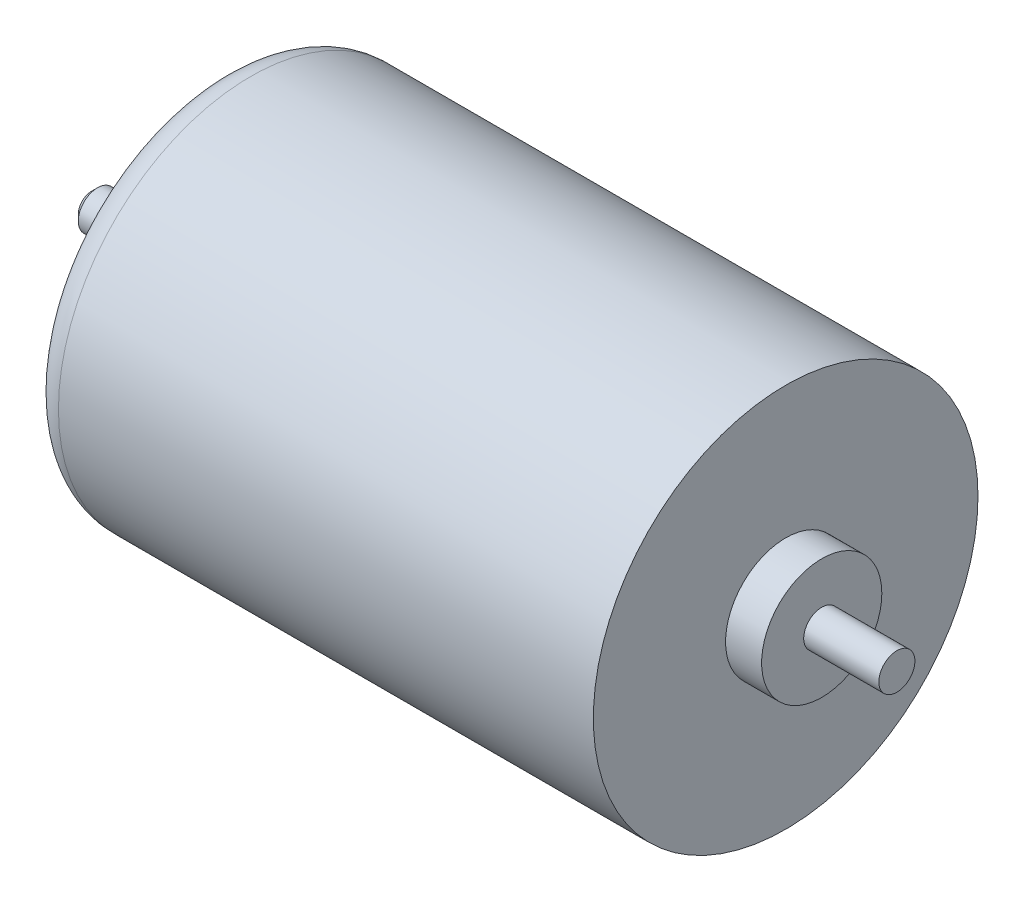
ISO-10303-21;
HEADER;
FILE_DESCRIPTION(('STEP AP214'),'2;1');
FILE_NAME('part.step','',(''),(''),'','','');
FILE_SCHEMA(('AUTOMOTIVE_DESIGN { 1 0 10303 214 1 1 1 1 }'));
ENDSEC;
DATA;
#1=APPLICATION_CONTEXT('core data for automotive mechanical design processes');
#2=APPLICATION_PROTOCOL_DEFINITION('international standard','automotive_design',2000,#1);
#3=PRODUCT_CONTEXT('',#1,'mechanical');
#4=PRODUCT('Part','Part','',(#3));
#5=PRODUCT_RELATED_PRODUCT_CATEGORY('part','',(#4));
#6=PRODUCT_DEFINITION_FORMATION('','',#4);
#7=PRODUCT_DEFINITION_CONTEXT('part definition',#1,'design');
#8=PRODUCT_DEFINITION('design','',#6,#7);
#9=PRODUCT_DEFINITION_SHAPE('','',#8);
#10=(LENGTH_UNIT() NAMED_UNIT(*) SI_UNIT(.MILLI.,.METRE.));
#11=(NAMED_UNIT(*) PLANE_ANGLE_UNIT() SI_UNIT($,.RADIAN.));
#12=(NAMED_UNIT(*) SI_UNIT($,.STERADIAN.) SOLID_ANGLE_UNIT());
#13=UNCERTAINTY_MEASURE_WITH_UNIT(LENGTH_MEASURE(1.E-05),#10,'distance_accuracy_value','');
#14=(GEOMETRIC_REPRESENTATION_CONTEXT(3) GLOBAL_UNCERTAINTY_ASSIGNED_CONTEXT((#13)) GLOBAL_UNIT_ASSIGNED_CONTEXT((#10,
#11,#12)) REPRESENTATION_CONTEXT('',''));
#15=CARTESIAN_POINT('',(0.,0.,0.));
#16=DIRECTION('',(0.,0.,1.));
#17=DIRECTION('',(1.,0.,0.));
#18=AXIS2_PLACEMENT_3D('',#15,#16,#17);
#19=CARTESIAN_POINT('',(-67.,0.,0.));
#20=DIRECTION('',(-1.,0.,0.));
#21=DIRECTION('',(0.,0.,1.));
#22=AXIS2_PLACEMENT_3D('',#19,#20,#21);
#23=PLANE('',#22);
#24=CARTESIAN_POINT('',(-67.,0.,0.));
#25=DIRECTION('',(-1.,0.,0.));
#26=DIRECTION('',(0.,0.,1.));
#27=AXIS2_PLACEMENT_3D('',#24,#25,#26);
#28=CIRCLE('',#27,1.10000000000002);
#29=CARTESIAN_POINT('',(-67.,0.,1.10000000000002));
#30=VERTEX_POINT('',#29);
#31=EDGE_CURVE('E11',#30,#30,#28,.T.);
#32=ORIENTED_EDGE('',*,*,#31,.T.);
#33=EDGE_LOOP('',(#32));
#34=FACE_BOUND('',#33,.T.);
#35=ADVANCED_FACE('F51',(#34),#23,.T.);
#36=CARTESIAN_POINT('',(0.,0.,0.));
#37=DIRECTION('',(1.,0.,0.));
#38=DIRECTION('',(0.,0.,-1.));
#39=AXIS2_PLACEMENT_3D('',#36,#37,#38);
#40=CYLINDRICAL_SURFACE('',#39,1.6);
#41=CARTESIAN_POINT('',(-66.5,0.,0.));
#42=DIRECTION('',(-1.,0.,0.));
#43=DIRECTION('',(0.,0.,1.));
#44=AXIS2_PLACEMENT_3D('',#41,#42,#43);
#45=CIRCLE('',#44,1.6);
#46=CARTESIAN_POINT('',(-66.5,0.,1.6));
#47=VERTEX_POINT('',#46);
#48=EDGE_CURVE('E61',#47,#47,#45,.F.);
#49=ORIENTED_EDGE('',*,*,#48,.T.);
#50=EDGE_LOOP('',(#49));
#51=FACE_BOUND('',#50,.T.);
#52=CARTESIAN_POINT('',(-59.85,0.,0.));
#53=DIRECTION('',(1.,0.,0.));
#54=DIRECTION('',(0.,0.,-1.));
#55=AXIS2_PLACEMENT_3D('',#52,#53,#54);
#56=CIRCLE('',#55,1.6);
#57=CARTESIAN_POINT('',(-59.85,0.,-1.6));
#58=VERTEX_POINT('',#57);
#59=EDGE_CURVE('E120',#58,#58,#56,.T.);
#60=ORIENTED_EDGE('',*,*,#59,.F.);
#61=EDGE_LOOP('',(#60));
#62=FACE_BOUND('',#61,.T.);
#63=ADVANCED_FACE('F135',(#51,#62),#40,.T.);
#64=CARTESIAN_POINT('',(-59.85,1.6,0.));
#65=DIRECTION('',(-1.,0.,0.));
#66=DIRECTION('',(0.,0.,1.));
#67=AXIS2_PLACEMENT_3D('',#64,#65,#66);
#68=PLANE('',#67);
#69=ORIENTED_EDGE('',*,*,#59,.T.);
#70=EDGE_LOOP('',(#69));
#71=FACE_BOUND('',#70,.T.);
#72=CARTESIAN_POINT('',(-59.85,0.,0.));
#73=DIRECTION('',(1.,0.,0.));
#74=DIRECTION('',(0.,0.,-1.));
#75=AXIS2_PLACEMENT_3D('',#72,#73,#74);
#76=CIRCLE('',#75,5.);
#77=CARTESIAN_POINT('',(-59.85,0.,-5.));
#78=VERTEX_POINT('',#77);
#79=EDGE_CURVE('E116',#78,#78,#76,.T.);
#80=ORIENTED_EDGE('',*,*,#79,.F.);
#81=EDGE_LOOP('',(#80));
#82=FACE_BOUND('',#81,.T.);
#83=ADVANCED_FACE('F152',(#71,#82),#68,.T.);
#84=CARTESIAN_POINT('',(0.,0.,0.));
#85=DIRECTION('',(1.,0.,0.));
#86=DIRECTION('',(0.,0.,-1.));
#87=AXIS2_PLACEMENT_3D('',#84,#85,#86);
#88=CYLINDRICAL_SURFACE('',#87,5.);
#89=ORIENTED_EDGE('',*,*,#79,.T.);
#90=EDGE_LOOP('',(#89));
#91=FACE_BOUND('',#90,.T.);
#92=CARTESIAN_POINT('',(-56.25,0.,0.));
#93=DIRECTION('',(1.,0.,0.));
#94=DIRECTION('',(0.,0.,-1.));
#95=AXIS2_PLACEMENT_3D('',#92,#93,#94);
#96=CIRCLE('',#95,5.);
#97=CARTESIAN_POINT('',(-56.25,0.,-5.));
#98=VERTEX_POINT('',#97);
#99=EDGE_CURVE('E112',#98,#98,#96,.T.);
#100=ORIENTED_EDGE('',*,*,#99,.F.);
#101=EDGE_LOOP('',(#100));
#102=FACE_BOUND('',#101,.T.);
#103=ADVANCED_FACE('F207',(#91,#102),#88,.T.);
#104=CARTESIAN_POINT('',(-56.25,5.,0.));
#105=DIRECTION('',(-1.,0.,0.));
#106=DIRECTION('',(0.,0.,1.));
#107=AXIS2_PLACEMENT_3D('',#104,#105,#106);
#108=PLANE('',#107);
#109=CARTESIAN_POINT('',(-56.25,10.3,0.));
#110=DIRECTION('',(-1.,0.,0.));
#111=DIRECTION('',(0.,0.,1.));
#112=AXIS2_PLACEMENT_3D('',#109,#110,#111);
#113=CIRCLE('',#112,1.24999999999999);
#114=CARTESIAN_POINT('',(-56.25,10.3,1.24999999999999));
#115=VERTEX_POINT('',#114);
#116=EDGE_CURVE('E79',#115,#115,#113,.T.);
#117=ORIENTED_EDGE('',*,*,#116,.F.);
#118=EDGE_LOOP('',(#117));
#119=FACE_BOUND('',#118,.T.);
#120=CARTESIAN_POINT('',(-56.25,-10.3,0.));
#121=DIRECTION('',(-1.,0.,0.));
#122=DIRECTION('',(0.,0.,1.));
#123=AXIS2_PLACEMENT_3D('',#120,#121,#122);
#124=CIRCLE('',#123,1.24999999999999);
#125=CARTESIAN_POINT('',(-56.25,-10.3,1.24999999999999));
#126=VERTEX_POINT('',#125);
#127=EDGE_CURVE('E78',#126,#126,#124,.T.);
#128=ORIENTED_EDGE('',*,*,#127,.F.);
#129=EDGE_LOOP('',(#128));
#130=FACE_BOUND('',#129,.T.);
#131=CARTESIAN_POINT('',(-56.25,0.,0.));
#132=DIRECTION('',(-1.,0.,0.));
#133=DIRECTION('',(0.,0.,1.));
#134=AXIS2_PLACEMENT_3D('',#131,#132,#133);
#135=CIRCLE('',#134,13.5);
#136=CARTESIAN_POINT('',(-56.25,0.,13.5));
#137=VERTEX_POINT('',#136);
#138=EDGE_CURVE('E128',#137,#137,#135,.T.);
#139=ORIENTED_EDGE('',*,*,#138,.T.);
#140=EDGE_LOOP('',(#139));
#141=FACE_BOUND('',#140,.T.);
#142=ORIENTED_EDGE('',*,*,#99,.T.);
#143=EDGE_LOOP('',(#142));
#144=FACE_BOUND('',#143,.T.);
#145=ADVANCED_FACE('F177',(#119,#130,#141,#144),#108,.T.);
#146=CARTESIAN_POINT('',(0.,0.,0.));
#147=DIRECTION('',(1.,0.,0.));
#148=DIRECTION('',(0.,0.,-1.));
#149=AXIS2_PLACEMENT_3D('',#146,#147,#148);
#150=CYLINDRICAL_SURFACE('',#149,16.);
#151=CARTESIAN_POINT('',(-53.75,0.,0.));
#152=DIRECTION('',(-1.,0.,0.));
#153=DIRECTION('',(0.,0.,1.));
#154=AXIS2_PLACEMENT_3D('',#151,#152,#153);
#155=CIRCLE('',#154,16.);
#156=CARTESIAN_POINT('',(-53.75,0.,16.));
#157=VERTEX_POINT('',#156);
#158=EDGE_CURVE('E124',#157,#157,#155,.F.);
#159=ORIENTED_EDGE('',*,*,#158,.T.);
#160=EDGE_LOOP('',(#159));
#161=FACE_BOUND('',#160,.T.);
#162=CARTESIAN_POINT('',(-9.25,0.,0.));
#163=DIRECTION('',(1.,0.,0.));
#164=DIRECTION('',(0.,0.,-1.));
#165=AXIS2_PLACEMENT_3D('',#162,#163,#164);
#166=CIRCLE('',#165,16.);
#167=CARTESIAN_POINT('',(-9.25,0.,-16.));
#168=VERTEX_POINT('',#167);
#169=EDGE_CURVE('E108',#168,#168,#166,.T.);
#170=ORIENTED_EDGE('',*,*,#169,.F.);
#171=EDGE_LOOP('',(#170));
#172=FACE_BOUND('',#171,.T.);
#173=ADVANCED_FACE('F174',(#161,#172),#150,.T.);
#174=CARTESIAN_POINT('',(-9.25,5.,0.));
#175=DIRECTION('',(1.,0.,0.));
#176=DIRECTION('',(0.,0.,-1.));
#177=AXIS2_PLACEMENT_3D('',#174,#175,#176);
#178=PLANE('',#177);
#179=ORIENTED_EDGE('',*,*,#169,.T.);
#180=EDGE_LOOP('',(#179));
#181=FACE_BOUND('',#180,.T.);
#182=CARTESIAN_POINT('',(-9.25,0.,0.));
#183=DIRECTION('',(1.,0.,0.));
#184=DIRECTION('',(0.,0.,-1.));
#185=AXIS2_PLACEMENT_3D('',#182,#183,#184);
#186=CIRCLE('',#185,5.);
#187=CARTESIAN_POINT('',(-9.25,0.,-5.));
#188=VERTEX_POINT('',#187);
#189=EDGE_CURVE('E104',#188,#188,#186,.T.);
#190=ORIENTED_EDGE('',*,*,#189,.F.);
#191=EDGE_LOOP('',(#190));
#192=FACE_BOUND('',#191,.T.);
#193=ADVANCED_FACE('F176',(#181,#192),#178,.T.);
#194=CARTESIAN_POINT('',(0.,0.,0.));
#195=DIRECTION('',(1.,0.,0.));
#196=DIRECTION('',(0.,0.,-1.));
#197=AXIS2_PLACEMENT_3D('',#194,#195,#196);
#198=CYLINDRICAL_SURFACE('',#197,5.);
#199=ORIENTED_EDGE('',*,*,#189,.T.);
#200=EDGE_LOOP('',(#199));
#201=FACE_BOUND('',#200,.T.);
#202=CARTESIAN_POINT('',(-6.25,0.,0.));
#203=DIRECTION('',(1.,0.,0.));
#204=DIRECTION('',(0.,0.,-1.));
#205=AXIS2_PLACEMENT_3D('',#202,#203,#204);
#206=CIRCLE('',#205,5.);
#207=CARTESIAN_POINT('',(-6.25,0.,-5.));
#208=VERTEX_POINT('',#207);
#209=EDGE_CURVE('E100',#208,#208,#206,.T.);
#210=ORIENTED_EDGE('',*,*,#209,.F.);
#211=EDGE_LOOP('',(#210));
#212=FACE_BOUND('',#211,.T.);
#213=ADVANCED_FACE('F183',(#201,#212),#198,.T.);
#214=CARTESIAN_POINT('',(-6.25,1.5,0.));
#215=DIRECTION('',(1.,0.,0.));
#216=DIRECTION('',(0.,0.,-1.));
#217=AXIS2_PLACEMENT_3D('',#214,#215,#216);
#218=PLANE('',#217);
#219=ORIENTED_EDGE('',*,*,#209,.T.);
#220=EDGE_LOOP('',(#219));
#221=FACE_BOUND('',#220,.T.);
#222=CARTESIAN_POINT('',(-6.25,0.,0.));
#223=DIRECTION('',(1.,0.,0.));
#224=DIRECTION('',(0.,0.,-1.));
#225=AXIS2_PLACEMENT_3D('',#222,#223,#224);
#226=CIRCLE('',#225,1.5);
#227=CARTESIAN_POINT('',(-6.25,0.,-1.5));
#228=VERTEX_POINT('',#227);
#229=EDGE_CURVE('E96',#228,#228,#226,.T.);
#230=ORIENTED_EDGE('',*,*,#229,.F.);
#231=EDGE_LOOP('',(#230));
#232=FACE_BOUND('',#231,.T.);
#233=ADVANCED_FACE('F189',(#221,#232),#218,.T.);
#234=CARTESIAN_POINT('',(0.,0.,0.));
#235=DIRECTION('',(1.,0.,0.));
#236=DIRECTION('',(0.,0.,-1.));
#237=AXIS2_PLACEMENT_3D('',#234,#235,#236);
#238=CYLINDRICAL_SURFACE('',#237,1.5);
#239=ORIENTED_EDGE('',*,*,#229,.T.);
#240=EDGE_LOOP('',(#239));
#241=FACE_BOUND('',#240,.T.);
#242=CARTESIAN_POINT('',(0.,0.,0.));
#243=DIRECTION('',(1.,0.,0.));
#244=DIRECTION('',(0.,0.,-1.));
#245=AXIS2_PLACEMENT_3D('',#242,#243,#244);
#246=CIRCLE('',#245,1.5);
#247=CARTESIAN_POINT('',(0.,0.,-1.5));
#248=VERTEX_POINT('',#247);
#249=EDGE_CURVE('E92',#248,#248,#246,.T.);
#250=ORIENTED_EDGE('',*,*,#249,.F.);
#251=EDGE_LOOP('',(#250));
#252=FACE_BOUND('',#251,.T.);
#253=ADVANCED_FACE('F167',(#241,#252),#238,.T.);
#254=CARTESIAN_POINT('',(0.,0.,0.));
#255=DIRECTION('',(1.,0.,0.));
#256=DIRECTION('',(0.,0.,-1.));
#257=AXIS2_PLACEMENT_3D('',#254,#255,#256);
#258=PLANE('',#257);
#259=ORIENTED_EDGE('',*,*,#249,.T.);
#260=EDGE_LOOP('',(#259));
#261=FACE_BOUND('',#260,.T.);
#262=ADVANCED_FACE('F158',(#261),#258,.T.);
#263=CARTESIAN_POINT('',(-53.75,0.,0.));
#264=DIRECTION('',(-1.,0.,0.));
#265=DIRECTION('',(0.,0.,1.));
#266=AXIS2_PLACEMENT_3D('',#263,#264,#265);
#267=TOROIDAL_SURFACE('',#266,13.5,2.5);
#268=ORIENTED_EDGE('',*,*,#138,.F.);
#269=EDGE_LOOP('',(#268));
#270=FACE_BOUND('',#269,.T.);
#271=ORIENTED_EDGE('',*,*,#158,.F.);
#272=EDGE_LOOP('',(#271));
#273=FACE_BOUND('',#272,.T.);
#274=ADVANCED_FACE('F155',(#270,#273),#267,.T.);
#275=CARTESIAN_POINT('',(-47.75,-10.3,0.));
#276=DIRECTION('',(-1.,0.,0.));
#277=DIRECTION('',(0.,0.,1.));
#278=AXIS2_PLACEMENT_3D('',#275,#276,#277);
#279=CONICAL_SURFACE('',#278,1.24999999999999,1.02974425867665);
#280=CARTESIAN_POINT('',(-46.9989242262155,-10.3,0.));
#281=VERTEX_POINT('',#280);
#282=VERTEX_LOOP('',#281);
#283=FACE_BOUND('',#282,.T.);
#284=CARTESIAN_POINT('',(-47.75,-10.3,0.));
#285=DIRECTION('',(-1.,0.,0.));
#286=DIRECTION('',(0.,0.,1.));
#287=AXIS2_PLACEMENT_3D('',#284,#285,#286);
#288=CIRCLE('',#287,1.24999999999999);
#289=CARTESIAN_POINT('',(-47.75,-10.3,1.24999999999999));
#290=VERTEX_POINT('',#289);
#291=EDGE_CURVE('E84',#290,#290,#288,.T.);
#292=ORIENTED_EDGE('',*,*,#291,.T.);
#293=EDGE_LOOP('',(#292));
#294=FACE_BOUND('',#293,.T.);
#295=ADVANCED_FACE('F157',(#283,#294),#279,.F.);
#296=CARTESIAN_POINT('',(-56.25,-10.3,0.));
#297=DIRECTION('',(-1.,0.,0.));
#298=DIRECTION('',(0.,0.,1.));
#299=AXIS2_PLACEMENT_3D('',#296,#297,#298);
#300=CYLINDRICAL_SURFACE('',#299,1.24999999999999);
#301=ORIENTED_EDGE('',*,*,#291,.F.);
#302=EDGE_LOOP('',(#301));
#303=FACE_BOUND('',#302,.T.);
#304=ORIENTED_EDGE('',*,*,#127,.T.);
#305=EDGE_LOOP('',(#304));
#306=FACE_BOUND('',#305,.T.);
#307=ADVANCED_FACE('F71',(#303,#306),#300,.F.);
#308=CARTESIAN_POINT('',(-47.75,10.3,0.));
#309=DIRECTION('',(-1.,0.,0.));
#310=DIRECTION('',(0.,0.,1.));
#311=AXIS2_PLACEMENT_3D('',#308,#309,#310);
#312=CONICAL_SURFACE('',#311,1.24999999999999,1.02974425867665);
#313=CARTESIAN_POINT('',(-46.9989242262155,10.3,0.));
#314=VERTEX_POINT('',#313);
#315=VERTEX_LOOP('',#314);
#316=FACE_BOUND('',#315,.T.);
#317=CARTESIAN_POINT('',(-47.75,10.3,0.));
#318=DIRECTION('',(-1.,0.,0.));
#319=DIRECTION('',(0.,0.,1.));
#320=AXIS2_PLACEMENT_3D('',#317,#318,#319);
#321=CIRCLE('',#320,1.24999999999999);
#322=CARTESIAN_POINT('',(-47.75,10.3,1.24999999999998));
#323=VERTEX_POINT('',#322);
#324=EDGE_CURVE('E75',#323,#323,#321,.T.);
#325=ORIENTED_EDGE('',*,*,#324,.T.);
#326=EDGE_LOOP('',(#325));
#327=FACE_BOUND('',#326,.T.);
#328=ADVANCED_FACE('F67',(#316,#327),#312,.F.);
#329=CARTESIAN_POINT('',(-56.25,10.3,0.));
#330=DIRECTION('',(-1.,0.,0.));
#331=DIRECTION('',(0.,0.,1.));
#332=AXIS2_PLACEMENT_3D('',#329,#330,#331);
#333=CYLINDRICAL_SURFACE('',#332,1.24999999999999);
#334=ORIENTED_EDGE('',*,*,#324,.F.);
#335=EDGE_LOOP('',(#334));
#336=FACE_BOUND('',#335,.T.);
#337=ORIENTED_EDGE('',*,*,#116,.T.);
#338=EDGE_LOOP('',(#337));
#339=FACE_BOUND('',#338,.T.);
#340=ADVANCED_FACE('F70',(#336,#339),#333,.F.);
#341=CARTESIAN_POINT('',(-66.5,0.,0.));
#342=DIRECTION('',(1.,0.,0.));
#343=DIRECTION('',(0.,0.,-1.));
#344=AXIS2_PLACEMENT_3D('',#341,#342,#343);
#345=CONICAL_SURFACE('',#344,1.6,0.785398163397445);
#346=ORIENTED_EDGE('',*,*,#31,.F.);
#347=EDGE_LOOP('',(#346));
#348=FACE_BOUND('',#347,.T.);
#349=ORIENTED_EDGE('',*,*,#48,.F.);
#350=EDGE_LOOP('',(#349));
#351=FACE_BOUND('',#350,.T.);
#352=ADVANCED_FACE('F54',(#348,#351),#345,.T.);
#353=CLOSED_SHELL('',(#35,#63,#83,#103,#145,#173,#193,#213,#233,#253,#262,#274,#295,#307,#328,
#340,#352));
#354=MANIFOLD_SOLID_BREP('B2',#353);
#355=ADVANCED_BREP_SHAPE_REPRESENTATION('',(#18,#354),#14);
#356=SHAPE_DEFINITION_REPRESENTATION(#9,#355);
ENDSEC;
END-ISO-10303-21;
